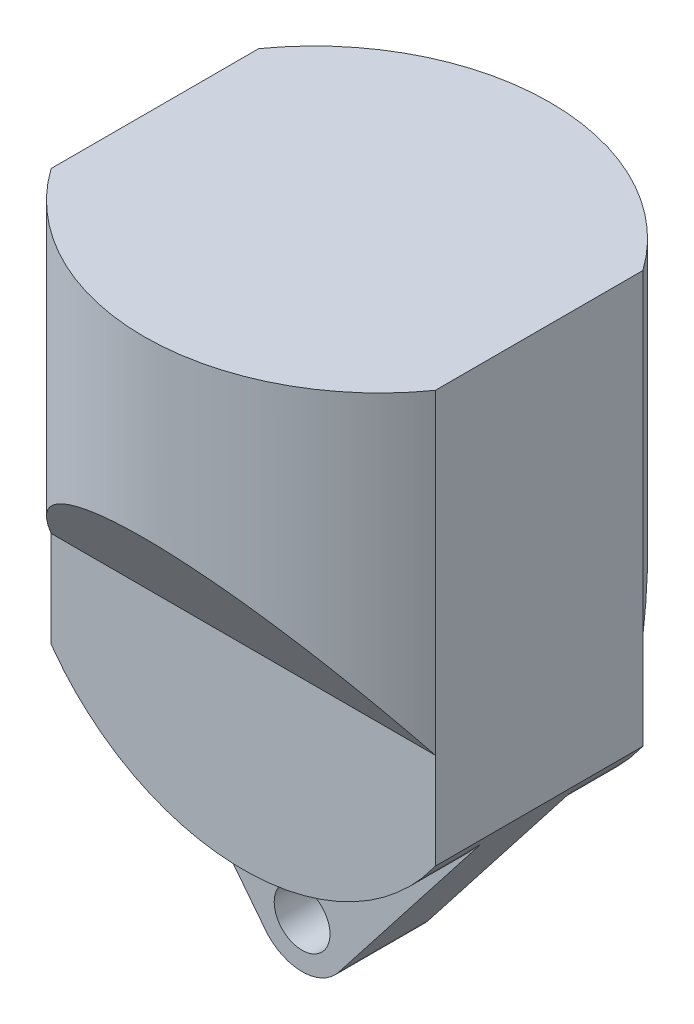
ISO-10303-21;
HEADER;
FILE_DESCRIPTION(('STEP AP214'),'2;1');
FILE_NAME('part.step','',(''),(''),'','','');
FILE_SCHEMA(('AUTOMOTIVE_DESIGN { 1 0 10303 214 1 1 1 1 }'));
ENDSEC;
DATA;
#1=APPLICATION_CONTEXT('core data for automotive mechanical design processes');
#2=APPLICATION_PROTOCOL_DEFINITION('international standard','automotive_design',2000,#1);
#3=PRODUCT_CONTEXT('',#1,'mechanical');
#4=PRODUCT('Part','Part','',(#3));
#5=PRODUCT_RELATED_PRODUCT_CATEGORY('part','',(#4));
#6=PRODUCT_DEFINITION_FORMATION('','',#4);
#7=PRODUCT_DEFINITION_CONTEXT('part definition',#1,'design');
#8=PRODUCT_DEFINITION('design','',#6,#7);
#9=PRODUCT_DEFINITION_SHAPE('','',#8);
#10=(LENGTH_UNIT() NAMED_UNIT(*) SI_UNIT(.MILLI.,.METRE.));
#11=(NAMED_UNIT(*) PLANE_ANGLE_UNIT() SI_UNIT($,.RADIAN.));
#12=(NAMED_UNIT(*) SI_UNIT($,.STERADIAN.) SOLID_ANGLE_UNIT());
#13=UNCERTAINTY_MEASURE_WITH_UNIT(LENGTH_MEASURE(1.E-05),#10,'distance_accuracy_value','');
#14=(GEOMETRIC_REPRESENTATION_CONTEXT(3) GLOBAL_UNCERTAINTY_ASSIGNED_CONTEXT((#13)) GLOBAL_UNIT_ASSIGNED_CONTEXT((#10,
#11,#12)) REPRESENTATION_CONTEXT('',''));
#15=CARTESIAN_POINT('',(0.,0.,0.));
#16=DIRECTION('',(0.,0.,1.));
#17=DIRECTION('',(1.,0.,0.));
#18=AXIS2_PLACEMENT_3D('',#15,#16,#17);
#19=CARTESIAN_POINT('',(0.,0.,67.));
#20=DIRECTION('',(0.,0.,1.));
#21=DIRECTION('',(1.,0.,0.));
#22=AXIS2_PLACEMENT_3D('',#19,#20,#21);
#23=PLANE('',#22);
#24=DIRECTION('',(0.,1.,0.));
#25=VECTOR('',#24,1.);
#26=CARTESIAN_POINT('',(62.,188.,67.));
#27=LINE('',#26,#25);
#28=CARTESIAN_POINT('',(62.,55.,67.));
#29=VERTEX_POINT('',#28);
#30=CARTESIAN_POINT('',(62.,86.,67.));
#31=VERTEX_POINT('',#30);
#32=EDGE_CURVE('E176',#29,#31,#27,.T.);
#33=ORIENTED_EDGE('',*,*,#32,.T.);
#34=DIRECTION('',(-1.,0.,0.));
#35=VECTOR('',#34,1.);
#36=CARTESIAN_POINT('',(-62.,86.,67.));
#37=LINE('',#36,#35);
#38=CARTESIAN_POINT('',(-62.,86.,67.));
#39=VERTEX_POINT('',#38);
#40=EDGE_CURVE('E166',#31,#39,#37,.T.);
#41=ORIENTED_EDGE('',*,*,#40,.T.);
#42=DIRECTION('',(0.,-1.,0.));
#43=VECTOR('',#42,1.);
#44=CARTESIAN_POINT('',(-61.9999999999993,55.,67.));
#45=LINE('',#44,#43);
#46=CARTESIAN_POINT('',(-61.9999999999993,55.,67.));
#47=VERTEX_POINT('',#46);
#48=EDGE_CURVE('E185',#39,#47,#45,.T.);
#49=ORIENTED_EDGE('',*,*,#48,.T.);
#50=DIRECTION('',(0.615661475325654,-0.788010753606725,0.));
#51=VECTOR('',#50,1.);
#52=CARTESIAN_POINT('',(-61.9999999999993,55.,67.));
#53=LINE('',#52,#51);
#54=CARTESIAN_POINT('',(-57.7528129662108,49.5638484957434,67.));
#55=VERTEX_POINT('',#54);
#56=EDGE_CURVE('E188',#47,#55,#53,.T.);
#57=ORIENTED_EDGE('',*,*,#56,.T.);
#58=CARTESIAN_POINT('',(0.,99.0624999999987,67.));
#59=DIRECTION('',(0.,0.,1.));
#60=DIRECTION('',(1.,0.,0.));
#61=AXIS2_PLACEMENT_3D('',#58,#59,#60);
#62=CIRCLE('',#61,76.062499999999);
#63=CARTESIAN_POINT('',(57.7528129662181,49.5638484957519,67.));
#64=VERTEX_POINT('',#63);
#65=EDGE_CURVE('E69',#55,#64,#62,.T.);
#66=ORIENTED_EDGE('',*,*,#65,.T.);
#67=DIRECTION('',(0.615661475325659,0.788010753606721,0.));
#68=VECTOR('',#67,1.);
#69=CARTESIAN_POINT('',(62.,55.,67.));
#70=LINE('',#69,#68);
#71=EDGE_CURVE('E183',#64,#29,#70,.T.);
#72=ORIENTED_EDGE('',*,*,#71,.T.);
#73=EDGE_LOOP('',(#33,#41,#49,#57,#66,#72));
#74=FACE_BOUND('',#73,.T.);
#75=ADVANCED_FACE('F61',(#74),#23,.T.);
#76=CARTESIAN_POINT('',(-61.9999999999993,55.,67.));
#77=DIRECTION('',(0.788010753606725,0.615661475325654,0.));
#78=DIRECTION('',(-0.615661475325654,0.788010753606725,0.));
#79=AXIS2_PLACEMENT_3D('',#76,#77,#78);
#80=PLANE('',#79);
#81=DIRECTION('',(-0.615661475325654,0.788010753606725,0.));
#82=VECTOR('',#81,1.);
#83=CARTESIAN_POINT('',(-61.9999999999993,55.,19.));
#84=LINE('',#83,#82);
#85=CARTESIAN_POINT('',(-12.0479631288437,-8.93569160423657,19.));
#86=VERTEX_POINT('',#85);
#87=CARTESIAN_POINT('',(-57.7528129662149,49.5638484957487,19.));
#88=VERTEX_POINT('',#87);
#89=EDGE_CURVE('E254',#86,#88,#84,.T.);
#90=ORIENTED_EDGE('',*,*,#89,.F.);
#91=DIRECTION('',(0.,0.,-1.));
#92=VECTOR('',#91,1.);
#93=CARTESIAN_POINT('',(-12.0479631288437,-8.93569160423657,67.));
#94=LINE('',#93,#92);
#95=CARTESIAN_POINT('',(-12.0479631288437,-8.93569160423657,48.));
#96=VERTEX_POINT('',#95);
#97=EDGE_CURVE('E217',#96,#86,#94,.T.);
#98=ORIENTED_EDGE('',*,*,#97,.F.);
#99=DIRECTION('',(0.615661475325654,-0.788010753606725,0.));
#100=VECTOR('',#99,1.);
#101=CARTESIAN_POINT('',(-61.9999999999993,55.,48.));
#102=LINE('',#101,#100);
#103=CARTESIAN_POINT('',(-57.7528129662108,49.5638484957434,48.));
#104=VERTEX_POINT('',#103);
#105=EDGE_CURVE('E197',#104,#96,#102,.T.);
#106=ORIENTED_EDGE('',*,*,#105,.F.);
#107=DIRECTION('',(0.,0.,1.));
#108=VECTOR('',#107,1.);
#109=CARTESIAN_POINT('',(-57.7528129662108,49.5638484957434,48.));
#110=LINE('',#109,#108);
#111=EDGE_CURVE('E259',#55,#104,#110,.F.);
#112=ORIENTED_EDGE('',*,*,#111,.F.);
#113=ORIENTED_EDGE('',*,*,#56,.F.);
#114=DIRECTION('',(0.,0.,-1.));
#115=VECTOR('',#114,1.);
#116=CARTESIAN_POINT('',(-61.9999999999993,55.,67.));
#117=LINE('',#116,#115);
#118=CARTESIAN_POINT('',(-61.9999999999993,55.,0.));
#119=VERTEX_POINT('',#118);
#120=EDGE_CURVE('E192',#47,#119,#117,.T.);
#121=ORIENTED_EDGE('',*,*,#120,.T.);
#122=DIRECTION('',(0.615661475325654,-0.788010753606725,0.));
#123=VECTOR('',#122,1.);
#124=CARTESIAN_POINT('',(-61.9999999999993,55.,0.));
#125=LINE('',#124,#123);
#126=CARTESIAN_POINT('',(-57.7528129662149,49.5638484957487,0.));
#127=VERTEX_POINT('',#126);
#128=EDGE_CURVE('E193',#119,#127,#125,.T.);
#129=ORIENTED_EDGE('',*,*,#128,.T.);
#130=DIRECTION('',(0.,0.,-1.));
#131=VECTOR('',#130,1.);
#132=CARTESIAN_POINT('',(-57.7528129662149,49.5638484957487,19.));
#133=LINE('',#132,#131);
#134=EDGE_CURVE('E75',#88,#127,#133,.T.);
#135=ORIENTED_EDGE('',*,*,#134,.F.);
#136=EDGE_LOOP('',(#90,#98,#106,#112,#113,#121,#129,#135));
#137=FACE_BOUND('',#136,.T.);
#138=ADVANCED_FACE('F63',(#137),#80,.F.);
#139=CARTESIAN_POINT('',(0.,0.,67.));
#140=DIRECTION('',(0.,0.,-1.));
#141=DIRECTION('',(-1.,0.,0.));
#142=AXIS2_PLACEMENT_3D('',#139,#140,#141);
#143=CYLINDRICAL_SURFACE('',#142,15.);
#144=CARTESIAN_POINT('',(0.,0.,19.));
#145=DIRECTION('',(0.,0.,-1.));
#146=DIRECTION('',(-1.,0.,0.));
#147=AXIS2_PLACEMENT_3D('',#144,#145,#146);
#148=CIRCLE('',#147,15.);
#149=CARTESIAN_POINT('',(12.0479631288438,-8.93569160423637,19.));
#150=VERTEX_POINT('',#149);
#151=EDGE_CURVE('E252',#150,#86,#148,.T.);
#152=ORIENTED_EDGE('',*,*,#151,.F.);
#153=DIRECTION('',(0.,0.,-1.));
#154=VECTOR('',#153,1.);
#155=CARTESIAN_POINT('',(12.0479631288438,-8.93569160423636,67.));
#156=LINE('',#155,#154);
#157=CARTESIAN_POINT('',(12.0479631288438,-8.93569160423637,48.));
#158=VERTEX_POINT('',#157);
#159=EDGE_CURVE('E214',#158,#150,#156,.T.);
#160=ORIENTED_EDGE('',*,*,#159,.F.);
#161=CARTESIAN_POINT('',(0.,0.,48.));
#162=DIRECTION('',(0.,0.,1.));
#163=DIRECTION('',(1.,0.,0.));
#164=AXIS2_PLACEMENT_3D('',#161,#162,#163);
#165=CIRCLE('',#164,15.);
#166=EDGE_CURVE('E263',#96,#158,#165,.T.);
#167=ORIENTED_EDGE('',*,*,#166,.F.);
#168=ORIENTED_EDGE('',*,*,#97,.T.);
#169=EDGE_LOOP('',(#152,#160,#167,#168));
#170=FACE_BOUND('',#169,.T.);
#171=ADVANCED_FACE('F275',(#170),#143,.T.);
#172=CARTESIAN_POINT('',(62.,55.,67.));
#173=DIRECTION('',(-0.788010753606721,0.615661475325659,0.));
#174=DIRECTION('',(-0.615661475325659,-0.788010753606721,0.));
#175=AXIS2_PLACEMENT_3D('',#172,#173,#174);
#176=PLANE('',#175);
#177=DIRECTION('',(-0.615661475325659,-0.788010753606721,0.));
#178=VECTOR('',#177,1.);
#179=CARTESIAN_POINT('',(62.,55.,19.));
#180=LINE('',#179,#178);
#181=CARTESIAN_POINT('',(57.7528129662147,49.5638484957476,19.));
#182=VERTEX_POINT('',#181);
#183=EDGE_CURVE('E250',#182,#150,#180,.T.);
#184=ORIENTED_EDGE('',*,*,#183,.F.);
#185=DIRECTION('',(0.,0.,-1.));
#186=VECTOR('',#185,1.);
#187=CARTESIAN_POINT('',(57.7528129662147,49.5638484957476,19.));
#188=LINE('',#187,#186);
#189=CARTESIAN_POINT('',(57.7528129662149,49.5638484957479,0.));
#190=VERTEX_POINT('',#189);
#191=EDGE_CURVE('E247',#190,#182,#188,.F.);
#192=ORIENTED_EDGE('',*,*,#191,.F.);
#193=DIRECTION('',(0.615661475325659,0.788010753606721,0.));
#194=VECTOR('',#193,1.);
#195=CARTESIAN_POINT('',(62.,55.,0.));
#196=LINE('',#195,#194);
#197=CARTESIAN_POINT('',(62.,55.,0.));
#198=VERTEX_POINT('',#197);
#199=EDGE_CURVE('E196',#190,#198,#196,.T.);
#200=ORIENTED_EDGE('',*,*,#199,.T.);
#201=DIRECTION('',(0.,0.,-1.));
#202=VECTOR('',#201,1.);
#203=CARTESIAN_POINT('',(62.,55.,67.));
#204=LINE('',#203,#202);
#205=EDGE_CURVE('E212',#29,#198,#204,.T.);
#206=ORIENTED_EDGE('',*,*,#205,.F.);
#207=ORIENTED_EDGE('',*,*,#71,.F.);
#208=DIRECTION('',(0.,0.,1.));
#209=VECTOR('',#208,1.);
#210=CARTESIAN_POINT('',(57.7528129662178,49.5638484957516,48.));
#211=LINE('',#210,#209);
#212=CARTESIAN_POINT('',(57.7528129662178,49.5638484957516,48.));
#213=VERTEX_POINT('',#212);
#214=EDGE_CURVE('E83',#213,#64,#211,.T.);
#215=ORIENTED_EDGE('',*,*,#214,.F.);
#216=DIRECTION('',(0.615661475325659,0.788010753606721,0.));
#217=VECTOR('',#216,1.);
#218=CARTESIAN_POINT('',(62.,55.,48.));
#219=LINE('',#218,#217);
#220=EDGE_CURVE('E261',#158,#213,#219,.T.);
#221=ORIENTED_EDGE('',*,*,#220,.F.);
#222=ORIENTED_EDGE('',*,*,#159,.T.);
#223=EDGE_LOOP('',(#184,#192,#200,#206,#207,#215,#221,#222));
#224=FACE_BOUND('',#223,.T.);
#225=ADVANCED_FACE('F224',(#224),#176,.F.);
#226=CARTESIAN_POINT('',(0.,0.,0.));
#227=DIRECTION('',(0.,0.,1.));
#228=DIRECTION('',(1.,0.,0.));
#229=AXIS2_PLACEMENT_3D('',#226,#227,#228);
#230=PLANE('',#229);
#231=DIRECTION('',(0.,-1.,0.));
#232=VECTOR('',#231,1.);
#233=CARTESIAN_POINT('',(-61.9999999999993,55.,0.));
#234=LINE('',#233,#232);
#235=CARTESIAN_POINT('',(-62.,86.,0.));
#236=VERTEX_POINT('',#235);
#237=EDGE_CURVE('E202',#236,#119,#234,.T.);
#238=ORIENTED_EDGE('',*,*,#237,.F.);
#239=DIRECTION('',(1.,0.,0.));
#240=VECTOR('',#239,1.);
#241=CARTESIAN_POINT('',(-62.,86.,0.));
#242=LINE('',#241,#240);
#243=CARTESIAN_POINT('',(62.,86.,0.));
#244=VERTEX_POINT('',#243);
#245=EDGE_CURVE('E236',#236,#244,#242,.T.);
#246=ORIENTED_EDGE('',*,*,#245,.T.);
#247=DIRECTION('',(0.,1.,0.));
#248=VECTOR('',#247,1.);
#249=CARTESIAN_POINT('',(62.,188.,0.));
#250=LINE('',#249,#248);
#251=EDGE_CURVE('E200',#198,#244,#250,.T.);
#252=ORIENTED_EDGE('',*,*,#251,.F.);
#253=ORIENTED_EDGE('',*,*,#199,.F.);
#254=CARTESIAN_POINT('',(3.33066907387547E-13,99.0624999999993,0.));
#255=DIRECTION('',(0.,0.,1.));
#256=DIRECTION('',(1.,0.,0.));
#257=AXIS2_PLACEMENT_3D('',#254,#255,#256);
#258=CIRCLE('',#257,76.0624999999993);
#259=EDGE_CURVE('E13',#127,#190,#258,.T.);
#260=ORIENTED_EDGE('',*,*,#259,.F.);
#261=ORIENTED_EDGE('',*,*,#128,.F.);
#262=EDGE_LOOP('',(#238,#246,#252,#253,#260,#261));
#263=FACE_BOUND('',#262,.T.);
#264=ADVANCED_FACE('F234',(#263),#230,.F.);
#265=CARTESIAN_POINT('',(62.,188.,67.));
#266=DIRECTION('',(-1.,0.,0.));
#267=DIRECTION('',(0.,0.,1.));
#268=AXIS2_PLACEMENT_3D('',#265,#266,#267);
#269=PLANE('',#268);
#270=ORIENTED_EDGE('',*,*,#251,.T.);
#271=DIRECTION('',(0.,1.,0.));
#272=VECTOR('',#271,1.);
#273=CARTESIAN_POINT('',(62.,86.,0.));
#274=LINE('',#273,#272);
#275=CARTESIAN_POINT('',(62.,188.,0.));
#276=VERTEX_POINT('',#275);
#277=EDGE_CURVE('E230',#244,#276,#274,.T.);
#278=ORIENTED_EDGE('',*,*,#277,.T.);
#279=DIRECTION('',(0.,0.,-1.));
#280=VECTOR('',#279,1.);
#281=CARTESIAN_POINT('',(62.,188.,67.));
#282=LINE('',#281,#280);
#283=CARTESIAN_POINT('',(62.,188.,67.));
#284=VERTEX_POINT('',#283);
#285=EDGE_CURVE('E179',#284,#276,#282,.T.);
#286=ORIENTED_EDGE('',*,*,#285,.F.);
#287=DIRECTION('',(0.,1.,0.));
#288=VECTOR('',#287,1.);
#289=CARTESIAN_POINT('',(62.,86.,67.));
#290=LINE('',#289,#288);
#291=EDGE_CURVE('E156',#31,#284,#290,.T.);
#292=ORIENTED_EDGE('',*,*,#291,.F.);
#293=ORIENTED_EDGE('',*,*,#32,.F.);
#294=ORIENTED_EDGE('',*,*,#205,.T.);
#295=EDGE_LOOP('',(#270,#278,#286,#292,#293,#294));
#296=FACE_BOUND('',#295,.T.);
#297=ADVANCED_FACE('F175',(#296),#269,.F.);
#298=CARTESIAN_POINT('',(-62.,188.,67.));
#299=DIRECTION('',(0.,-1.,0.));
#300=DIRECTION('',(0.,0.,-1.));
#301=AXIS2_PLACEMENT_3D('',#298,#299,#300);
#302=PLANE('',#301);
#303=ORIENTED_EDGE('',*,*,#285,.T.);
#304=CARTESIAN_POINT('',(0.,188.,44.0625));
#305=DIRECTION('',(0.,1.,0.));
#306=DIRECTION('',(0.,0.,-1.));
#307=AXIS2_PLACEMENT_3D('',#304,#305,#306);
#308=CIRCLE('',#307,76.0625);
#309=CARTESIAN_POINT('',(-62.,188.,0.));
#310=VERTEX_POINT('',#309);
#311=EDGE_CURVE('E180',#276,#310,#308,.T.);
#312=ORIENTED_EDGE('',*,*,#311,.T.);
#313=DIRECTION('',(0.,0.,-1.));
#314=VECTOR('',#313,1.);
#315=CARTESIAN_POINT('',(-62.,188.,67.));
#316=LINE('',#315,#314);
#317=CARTESIAN_POINT('',(-62.,188.,67.));
#318=VERTEX_POINT('',#317);
#319=EDGE_CURVE('E208',#318,#310,#316,.T.);
#320=ORIENTED_EDGE('',*,*,#319,.F.);
#321=CARTESIAN_POINT('',(0.,188.,22.9375));
#322=DIRECTION('',(0.,1.,0.));
#323=DIRECTION('',(0.,0.,1.));
#324=AXIS2_PLACEMENT_3D('',#321,#322,#323);
#325=CIRCLE('',#324,76.0625);
#326=EDGE_CURVE('E170',#318,#284,#325,.T.);
#327=ORIENTED_EDGE('',*,*,#326,.T.);
#328=EDGE_LOOP('',(#303,#312,#320,#327));
#329=FACE_BOUND('',#328,.T.);
#330=ADVANCED_FACE('F288',(#329),#302,.F.);
#331=CARTESIAN_POINT('',(-61.9999999999993,55.,67.));
#332=DIRECTION('',(1.,0.,0.));
#333=DIRECTION('',(0.,1.,0.));
#334=AXIS2_PLACEMENT_3D('',#331,#332,#333);
#335=PLANE('',#334);
#336=EDGE_CURVE('E203',#310,#236,#234,.T.);
#337=ORIENTED_EDGE('',*,*,#336,.T.);
#338=ORIENTED_EDGE('',*,*,#237,.T.);
#339=ORIENTED_EDGE('',*,*,#120,.F.);
#340=ORIENTED_EDGE('',*,*,#48,.F.);
#341=EDGE_CURVE('E159',#318,#39,#45,.T.);
#342=ORIENTED_EDGE('',*,*,#341,.F.);
#343=ORIENTED_EDGE('',*,*,#319,.T.);
#344=EDGE_LOOP('',(#337,#338,#339,#340,#342,#343));
#345=FACE_BOUND('',#344,.T.);
#346=ADVANCED_FACE('F284',(#345),#335,.F.);
#347=CARTESIAN_POINT('',(0.,86.5,48.));
#348=DIRECTION('',(0.,0.,1.));
#349=DIRECTION('',(1.,0.,0.));
#350=AXIS2_PLACEMENT_3D('',#347,#348,#349);
#351=PLANE('',#350);
#352=CARTESIAN_POINT('',(0.,0.,48.));
#353=DIRECTION('',(0.,0.,1.));
#354=DIRECTION('',(1.,0.,0.));
#355=AXIS2_PLACEMENT_3D('',#352,#353,#354);
#356=CIRCLE('',#355,9.);
#357=CARTESIAN_POINT('',(9.,0.,48.));
#358=VERTEX_POINT('',#357);
#359=EDGE_CURVE('E163',#358,#358,#356,.T.);
#360=ORIENTED_EDGE('',*,*,#359,.F.);
#361=EDGE_LOOP('',(#360));
#362=FACE_BOUND('',#361,.T.);
#363=ORIENTED_EDGE('',*,*,#105,.T.);
#364=ORIENTED_EDGE('',*,*,#166,.T.);
#365=ORIENTED_EDGE('',*,*,#220,.T.);
#366=CARTESIAN_POINT('',(0.,99.0624999999987,48.));
#367=DIRECTION('',(0.,0.,1.));
#368=DIRECTION('',(1.,0.,0.));
#369=AXIS2_PLACEMENT_3D('',#366,#367,#368);
#370=CIRCLE('',#369,76.062499999999);
#371=EDGE_CURVE('E256',#104,#213,#370,.T.);
#372=ORIENTED_EDGE('',*,*,#371,.F.);
#373=EDGE_LOOP('',(#363,#364,#365,#372));
#374=FACE_BOUND('',#373,.T.);
#375=ADVANCED_FACE('F269',(#362,#374),#351,.T.);
#376=CARTESIAN_POINT('',(0.,99.0624999999987,48.));
#377=DIRECTION('',(0.,0.,1.));
#378=DIRECTION('',(1.,0.,0.));
#379=AXIS2_PLACEMENT_3D('',#376,#377,#378);
#380=CYLINDRICAL_SURFACE('',#379,76.062499999999);
#381=ORIENTED_EDGE('',*,*,#111,.T.);
#382=ORIENTED_EDGE('',*,*,#371,.T.);
#383=ORIENTED_EDGE('',*,*,#214,.T.);
#384=ORIENTED_EDGE('',*,*,#65,.F.);
#385=EDGE_LOOP('',(#381,#382,#383,#384));
#386=FACE_BOUND('',#385,.T.);
#387=ADVANCED_FACE('F281',(#386),#380,.T.);
#388=CARTESIAN_POINT('',(0.,86.5,19.));
#389=DIRECTION('',(0.,0.,-1.));
#390=DIRECTION('',(-1.,0.,0.));
#391=AXIS2_PLACEMENT_3D('',#388,#389,#390);
#392=PLANE('',#391);
#393=CARTESIAN_POINT('',(0.,0.,19.));
#394=DIRECTION('',(0.,0.,-1.));
#395=DIRECTION('',(-1.,0.,0.));
#396=AXIS2_PLACEMENT_3D('',#393,#394,#395);
#397=CIRCLE('',#396,9.);
#398=CARTESIAN_POINT('',(-9.,0.,19.));
#399=VERTEX_POINT('',#398);
#400=EDGE_CURVE('E293',#399,#399,#397,.T.);
#401=ORIENTED_EDGE('',*,*,#400,.F.);
#402=EDGE_LOOP('',(#401));
#403=FACE_BOUND('',#402,.T.);
#404=ORIENTED_EDGE('',*,*,#89,.T.);
#405=CARTESIAN_POINT('',(3.33066907387547E-13,99.0624999999993,19.));
#406=DIRECTION('',(0.,0.,-1.));
#407=DIRECTION('',(-1.,0.,0.));
#408=AXIS2_PLACEMENT_3D('',#405,#406,#407);
#409=CIRCLE('',#408,76.0624999999993);
#410=EDGE_CURVE('E240',#182,#88,#409,.T.);
#411=ORIENTED_EDGE('',*,*,#410,.F.);
#412=ORIENTED_EDGE('',*,*,#183,.T.);
#413=ORIENTED_EDGE('',*,*,#151,.T.);
#414=EDGE_LOOP('',(#404,#411,#412,#413));
#415=FACE_BOUND('',#414,.T.);
#416=ADVANCED_FACE('F279',(#403,#415),#392,.T.);
#417=CARTESIAN_POINT('',(3.33066907387547E-13,99.0624999999993,19.));
#418=DIRECTION('',(0.,0.,-1.));
#419=DIRECTION('',(-1.,0.,0.));
#420=AXIS2_PLACEMENT_3D('',#417,#418,#419);
#421=CYLINDRICAL_SURFACE('',#420,76.0624999999993);
#422=ORIENTED_EDGE('',*,*,#134,.T.);
#423=ORIENTED_EDGE('',*,*,#259,.T.);
#424=ORIENTED_EDGE('',*,*,#191,.T.);
#425=ORIENTED_EDGE('',*,*,#410,.T.);
#426=EDGE_LOOP('',(#422,#423,#424,#425));
#427=FACE_BOUND('',#426,.T.);
#428=ADVANCED_FACE('F280',(#427),#421,.T.);
#429=CARTESIAN_POINT('',(0.,86.,44.0625));
#430=DIRECTION('',(0.,1.,0.));
#431=DIRECTION('',(0.,0.,1.));
#432=AXIS2_PLACEMENT_3D('',#429,#430,#431);
#433=CYLINDRICAL_SURFACE('',#432,76.0625);
#434=CARTESIAN_POINT('',(0.,23.0722284529258,44.0625));
#435=DIRECTION('',(0.,0.573576436351047,0.819152044288991));
#436=DIRECTION('',(0.,0.819152044288991,-0.573576436351047));
#437=AXIS2_PLACEMENT_3D('',#434,#435,#436);
#438=ELLIPSE('',#437,132.610921891929,76.0625);
#439=EDGE_CURVE('E162',#236,#244,#438,.F.);
#440=ORIENTED_EDGE('',*,*,#439,.F.);
#441=ORIENTED_EDGE('',*,*,#336,.F.);
#442=ORIENTED_EDGE('',*,*,#311,.F.);
#443=ORIENTED_EDGE('',*,*,#277,.F.);
#444=EDGE_LOOP('',(#440,#441,#442,#443));
#445=FACE_BOUND('',#444,.T.);
#446=ADVANCED_FACE('F286',(#445),#433,.T.);
#447=CARTESIAN_POINT('',(0.,86.,22.9375));
#448=DIRECTION('',(0.,1.,0.));
#449=DIRECTION('',(0.,0.,1.));
#450=AXIS2_PLACEMENT_3D('',#447,#448,#449);
#451=CYLINDRICAL_SURFACE('',#450,76.0625);
#452=CARTESIAN_POINT('',(0.,23.0722284529257,22.9375));
#453=DIRECTION('',(0.,0.573576436351047,-0.819152044288991));
#454=DIRECTION('',(0.,0.819152044288991,0.573576436351047));
#455=AXIS2_PLACEMENT_3D('',#452,#453,#454);
#456=ELLIPSE('',#455,132.61092189193,76.0625);
#457=EDGE_CURVE('E151',#31,#39,#456,.F.);
#458=ORIENTED_EDGE('',*,*,#457,.F.);
#459=ORIENTED_EDGE('',*,*,#291,.T.);
#460=ORIENTED_EDGE('',*,*,#326,.F.);
#461=ORIENTED_EDGE('',*,*,#341,.T.);
#462=EDGE_LOOP('',(#458,#459,#460,#461));
#463=FACE_BOUND('',#462,.T.);
#464=ADVANCED_FACE('F153',(#463),#451,.T.);
#465=CARTESIAN_POINT('',(-62.,86.,0.));
#466=DIRECTION('',(0.,0.573576436351047,0.819152044288991));
#467=DIRECTION('',(0.,-0.819152044288991,0.573576436351047));
#468=AXIS2_PLACEMENT_3D('',#465,#466,#467);
#469=PLANE('',#468);
#470=ORIENTED_EDGE('',*,*,#439,.T.);
#471=ORIENTED_EDGE('',*,*,#245,.F.);
#472=EDGE_LOOP('',(#470,#471));
#473=FACE_BOUND('',#472,.T.);
#474=ADVANCED_FACE('F404',(#473),#469,.F.);
#475=CARTESIAN_POINT('',(-62.,86.,67.));
#476=DIRECTION('',(0.,0.573576436351047,-0.819152044288991));
#477=DIRECTION('',(0.,0.819152044288991,0.573576436351047));
#478=AXIS2_PLACEMENT_3D('',#475,#476,#477);
#479=PLANE('',#478);
#480=ORIENTED_EDGE('',*,*,#457,.T.);
#481=ORIENTED_EDGE('',*,*,#40,.F.);
#482=EDGE_LOOP('',(#480,#481));
#483=FACE_BOUND('',#482,.T.);
#484=ADVANCED_FACE('F167',(#483),#479,.F.);
#485=CARTESIAN_POINT('',(0.,0.,99.));
#486=DIRECTION('',(0.,0.,-1.));
#487=DIRECTION('',(-1.,0.,0.));
#488=AXIS2_PLACEMENT_3D('',#485,#486,#487);
#489=CYLINDRICAL_SURFACE('',#488,9.);
#490=ORIENTED_EDGE('',*,*,#359,.T.);
#491=EDGE_LOOP('',(#490));
#492=FACE_BOUND('',#491,.T.);
#493=ORIENTED_EDGE('',*,*,#400,.T.);
#494=EDGE_LOOP('',(#493));
#495=FACE_BOUND('',#494,.T.);
#496=ADVANCED_FACE('F297',(#492,#495),#489,.F.);
#497=CLOSED_SHELL('',(#75,#138,#171,#225,#264,#297,#330,#346,#375,#387,#416,#428,#446,#464,#474,
#484,#496));
#498=MANIFOLD_SOLID_BREP('B2',#497);
#499=ADVANCED_BREP_SHAPE_REPRESENTATION('',(#18,#498),#14);
#500=SHAPE_DEFINITION_REPRESENTATION(#9,#499);
ENDSEC;
END-ISO-10303-21;
